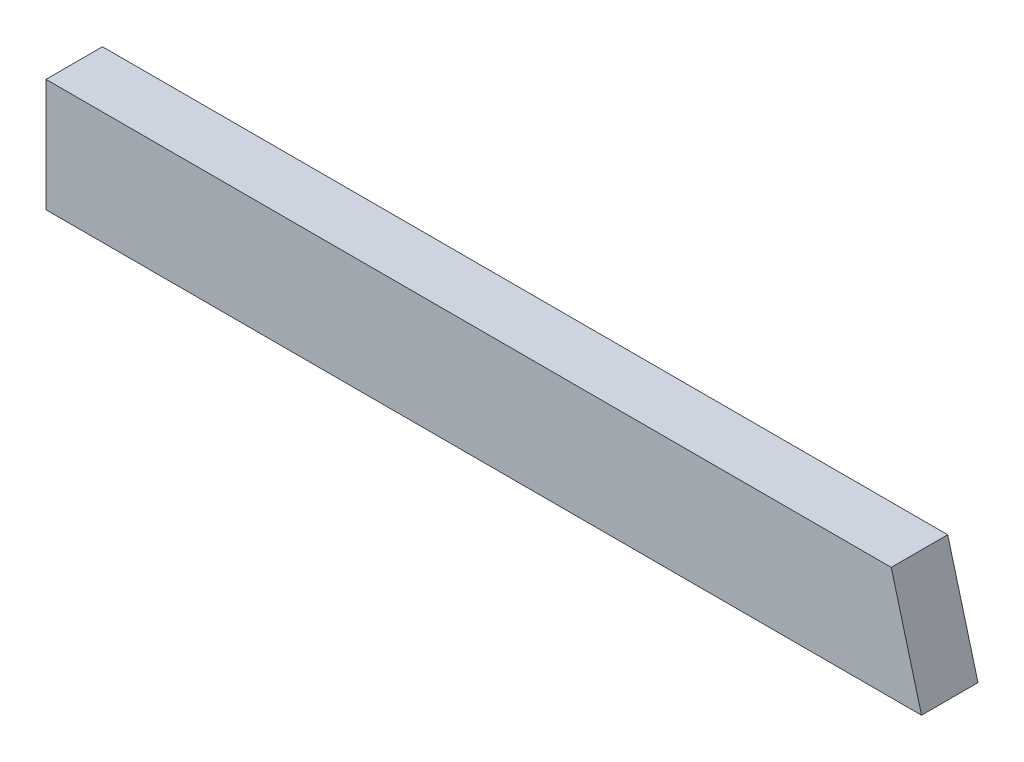
ISO-10303-21;
HEADER;
FILE_DESCRIPTION(('STEP AP214'),'2;1');
FILE_NAME('part.step','',(''),(''),'','','');
FILE_SCHEMA(('AUTOMOTIVE_DESIGN { 1 0 10303 214 1 1 1 1 }'));
ENDSEC;
DATA;
#1=APPLICATION_CONTEXT('core data for automotive mechanical design processes');
#2=APPLICATION_PROTOCOL_DEFINITION('international standard','automotive_design',2000,#1);
#3=PRODUCT_CONTEXT('',#1,'mechanical');
#4=PRODUCT('Part','Part','',(#3));
#5=PRODUCT_RELATED_PRODUCT_CATEGORY('part','',(#4));
#6=PRODUCT_DEFINITION_FORMATION('','',#4);
#7=PRODUCT_DEFINITION_CONTEXT('part definition',#1,'design');
#8=PRODUCT_DEFINITION('design','',#6,#7);
#9=PRODUCT_DEFINITION_SHAPE('','',#8);
#10=(LENGTH_UNIT() NAMED_UNIT(*) SI_UNIT(.MILLI.,.METRE.));
#11=(NAMED_UNIT(*) PLANE_ANGLE_UNIT() SI_UNIT($,.RADIAN.));
#12=(NAMED_UNIT(*) SI_UNIT($,.STERADIAN.) SOLID_ANGLE_UNIT());
#13=UNCERTAINTY_MEASURE_WITH_UNIT(LENGTH_MEASURE(1.E-05),#10,'distance_accuracy_value','');
#14=(GEOMETRIC_REPRESENTATION_CONTEXT(3) GLOBAL_UNCERTAINTY_ASSIGNED_CONTEXT((#13)) GLOBAL_UNIT_ASSIGNED_CONTEXT((#10,
#11,#12)) REPRESENTATION_CONTEXT('',''));
#15=CARTESIAN_POINT('',(0.,0.,0.));
#16=DIRECTION('',(0.,0.,1.));
#17=DIRECTION('',(1.,0.,0.));
#18=AXIS2_PLACEMENT_3D('',#15,#16,#17);
#19=CARTESIAN_POINT('',(0.,101.6,50.8));
#20=DIRECTION('',(0.,1.,0.));
#21=DIRECTION('',(0.,0.,1.));
#22=AXIS2_PLACEMENT_3D('',#19,#20,#21);
#23=PLANE('',#22);
#24=DIRECTION('',(1.,0.,0.));
#25=VECTOR('',#24,1.);
#26=CARTESIAN_POINT('',(0.,101.6,0.));
#27=LINE('',#26,#25);
#28=CARTESIAN_POINT('',(0.,101.6,0.));
#29=VERTEX_POINT('',#28);
#30=CARTESIAN_POINT('',(760.176362048998,101.6,0.));
#31=VERTEX_POINT('',#30);
#32=EDGE_CURVE('E101',#29,#31,#27,.T.);
#33=ORIENTED_EDGE('',*,*,#32,.F.);
#34=DIRECTION('',(0.,0.,-1.));
#35=VECTOR('',#34,1.);
#36=CARTESIAN_POINT('',(0.,101.6,50.8));
#37=LINE('',#36,#35);
#38=CARTESIAN_POINT('',(0.,101.6,50.8));
#39=VERTEX_POINT('',#38);
#40=EDGE_CURVE('E11',#39,#29,#37,.T.);
#41=ORIENTED_EDGE('',*,*,#40,.F.);
#42=DIRECTION('',(1.,0.,0.));
#43=VECTOR('',#42,1.);
#44=CARTESIAN_POINT('',(0.,101.6,50.8));
#45=LINE('',#44,#43);
#46=CARTESIAN_POINT('',(760.176362048998,101.6,50.8));
#47=VERTEX_POINT('',#46);
#48=EDGE_CURVE('E95',#39,#47,#45,.T.);
#49=ORIENTED_EDGE('',*,*,#48,.T.);
#50=DIRECTION('',(0.,0.,-1.));
#51=VECTOR('',#50,1.);
#52=CARTESIAN_POINT('',(760.176362048998,101.6,50.8));
#53=LINE('',#52,#51);
#54=EDGE_CURVE('E76',#47,#31,#53,.T.);
#55=ORIENTED_EDGE('',*,*,#54,.T.);
#56=EDGE_LOOP('',(#33,#41,#49,#55));
#57=FACE_BOUND('',#56,.T.);
#58=ADVANCED_FACE('F38',(#57),#23,.T.);
#59=CARTESIAN_POINT('',(0.,0.,50.8));
#60=DIRECTION('',(-1.,0.,0.));
#61=DIRECTION('',(0.,0.,1.));
#62=AXIS2_PLACEMENT_3D('',#59,#60,#61);
#63=PLANE('',#62);
#64=DIRECTION('',(0.,1.,0.));
#65=VECTOR('',#64,1.);
#66=CARTESIAN_POINT('',(0.,0.,0.));
#67=LINE('',#66,#65);
#68=CARTESIAN_POINT('',(0.,0.,0.));
#69=VERTEX_POINT('',#68);
#70=EDGE_CURVE('E89',#69,#29,#67,.T.);
#71=ORIENTED_EDGE('',*,*,#70,.F.);
#72=DIRECTION('',(0.,0.,-1.));
#73=VECTOR('',#72,1.);
#74=CARTESIAN_POINT('',(0.,0.,50.8));
#75=LINE('',#74,#73);
#76=CARTESIAN_POINT('',(0.,0.,50.8));
#77=VERTEX_POINT('',#76);
#78=EDGE_CURVE('E46',#77,#69,#75,.T.);
#79=ORIENTED_EDGE('',*,*,#78,.F.);
#80=DIRECTION('',(0.,1.,0.));
#81=VECTOR('',#80,1.);
#82=CARTESIAN_POINT('',(0.,0.,50.8));
#83=LINE('',#82,#81);
#84=EDGE_CURVE('E87',#77,#39,#83,.T.);
#85=ORIENTED_EDGE('',*,*,#84,.T.);
#86=ORIENTED_EDGE('',*,*,#40,.T.);
#87=EDGE_LOOP('',(#71,#79,#85,#86));
#88=FACE_BOUND('',#87,.T.);
#89=ADVANCED_FACE('F85',(#88),#63,.T.);
#90=CARTESIAN_POINT('',(0.,0.,50.8));
#91=DIRECTION('',(0.,1.,0.));
#92=DIRECTION('',(0.,0.,1.));
#93=AXIS2_PLACEMENT_3D('',#90,#91,#92);
#94=PLANE('',#93);
#95=DIRECTION('',(1.,0.,0.));
#96=VECTOR('',#95,1.);
#97=CARTESIAN_POINT('',(0.,0.,0.));
#98=LINE('',#97,#96);
#99=CARTESIAN_POINT('',(787.4,0.,0.));
#100=VERTEX_POINT('',#99);
#101=EDGE_CURVE('E69',#69,#100,#98,.T.);
#102=ORIENTED_EDGE('',*,*,#101,.T.);
#103=DIRECTION('',(0.,0.,-1.));
#104=VECTOR('',#103,1.);
#105=CARTESIAN_POINT('',(787.4,0.,50.8));
#106=LINE('',#105,#104);
#107=CARTESIAN_POINT('',(787.4,0.,50.8));
#108=VERTEX_POINT('',#107);
#109=EDGE_CURVE('E90',#108,#100,#106,.T.);
#110=ORIENTED_EDGE('',*,*,#109,.F.);
#111=DIRECTION('',(1.,0.,0.));
#112=VECTOR('',#111,1.);
#113=CARTESIAN_POINT('',(0.,0.,50.8));
#114=LINE('',#113,#112);
#115=EDGE_CURVE('E91',#77,#108,#114,.T.);
#116=ORIENTED_EDGE('',*,*,#115,.F.);
#117=ORIENTED_EDGE('',*,*,#78,.T.);
#118=EDGE_LOOP('',(#102,#110,#116,#117));
#119=FACE_BOUND('',#118,.T.);
#120=ADVANCED_FACE('F92',(#119),#94,.F.);
#121=CARTESIAN_POINT('',(734.654201469933,196.85,50.8));
#122=DIRECTION('',(-0.965925826289068,-0.258819045102521,0.));
#123=DIRECTION('',(0.258819045102521,-0.965925826289068,0.));
#124=AXIS2_PLACEMENT_3D('',#121,#122,#123);
#125=PLANE('',#124);
#126=DIRECTION('',(-0.258819045102521,0.965925826289068,0.));
#127=VECTOR('',#126,1.);
#128=CARTESIAN_POINT('',(734.654201469933,196.85,0.));
#129=LINE('',#128,#127);
#130=EDGE_CURVE('E97',#100,#31,#129,.T.);
#131=ORIENTED_EDGE('',*,*,#130,.T.);
#132=ORIENTED_EDGE('',*,*,#54,.F.);
#133=DIRECTION('',(-0.258819045102521,0.965925826289068,0.));
#134=VECTOR('',#133,1.);
#135=CARTESIAN_POINT('',(734.654201469933,196.85,50.8));
#136=LINE('',#135,#134);
#137=EDGE_CURVE('E54',#108,#47,#136,.T.);
#138=ORIENTED_EDGE('',*,*,#137,.F.);
#139=ORIENTED_EDGE('',*,*,#109,.T.);
#140=EDGE_LOOP('',(#131,#132,#138,#139));
#141=FACE_BOUND('',#140,.T.);
#142=ADVANCED_FACE('F110',(#141),#125,.F.);
#143=CARTESIAN_POINT('',(0.,0.,50.8));
#144=DIRECTION('',(0.,0.,1.));
#145=DIRECTION('',(1.,0.,0.));
#146=AXIS2_PLACEMENT_3D('',#143,#144,#145);
#147=PLANE('',#146);
#148=ORIENTED_EDGE('',*,*,#48,.F.);
#149=ORIENTED_EDGE('',*,*,#84,.F.);
#150=ORIENTED_EDGE('',*,*,#115,.T.);
#151=ORIENTED_EDGE('',*,*,#137,.T.);
#152=EDGE_LOOP('',(#148,#149,#150,#151));
#153=FACE_BOUND('',#152,.T.);
#154=ADVANCED_FACE('F94',(#153),#147,.T.);
#155=CARTESIAN_POINT('',(0.,0.,0.));
#156=DIRECTION('',(0.,0.,1.));
#157=DIRECTION('',(1.,0.,0.));
#158=AXIS2_PLACEMENT_3D('',#155,#156,#157);
#159=PLANE('',#158);
#160=ORIENTED_EDGE('',*,*,#32,.T.);
#161=ORIENTED_EDGE('',*,*,#130,.F.);
#162=ORIENTED_EDGE('',*,*,#101,.F.);
#163=ORIENTED_EDGE('',*,*,#70,.T.);
#164=EDGE_LOOP('',(#160,#161,#162,#163));
#165=FACE_BOUND('',#164,.T.);
#166=ADVANCED_FACE('F112',(#165),#159,.F.);
#167=CLOSED_SHELL('',(#58,#89,#120,#142,#154,#166));
#168=MANIFOLD_SOLID_BREP('B2',#167);
#169=ADVANCED_BREP_SHAPE_REPRESENTATION('',(#18,#168),#14);
#170=SHAPE_DEFINITION_REPRESENTATION(#9,#169);
ENDSEC;
END-ISO-10303-21;
